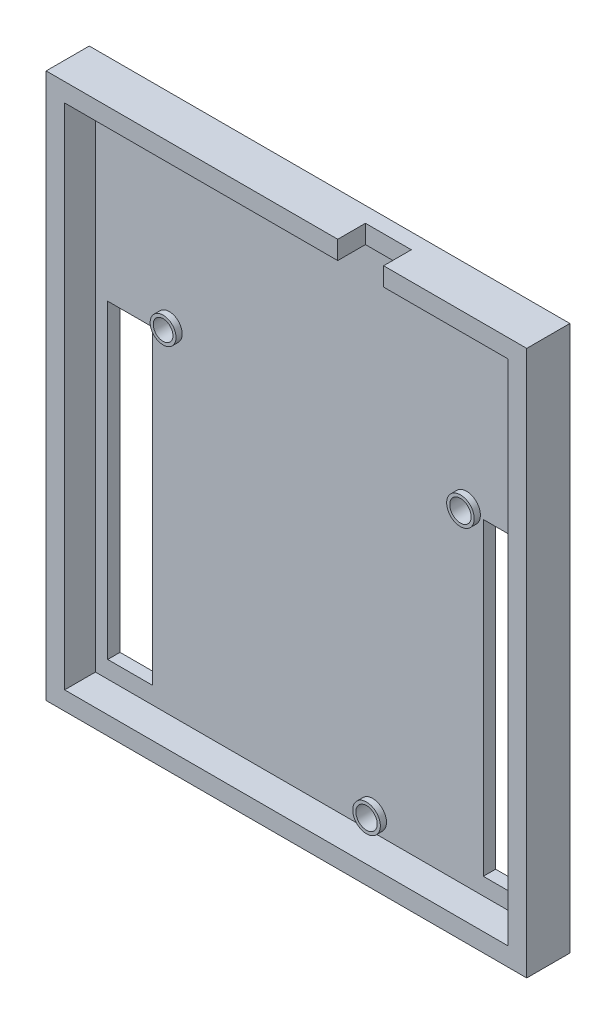
ISO-10303-21;
HEADER;
FILE_DESCRIPTION(('STEP AP214'),'2;1');
FILE_NAME('part.step','',(''),(''),'','','');
FILE_SCHEMA(('AUTOMOTIVE_DESIGN { 1 0 10303 214 1 1 1 1 }'));
ENDSEC;
DATA;
#1=APPLICATION_CONTEXT('core data for automotive mechanical design processes');
#2=APPLICATION_PROTOCOL_DEFINITION('international standard','automotive_design',2000,#1);
#3=PRODUCT_CONTEXT('',#1,'mechanical');
#4=PRODUCT('Part','Part','',(#3));
#5=PRODUCT_RELATED_PRODUCT_CATEGORY('part','',(#4));
#6=PRODUCT_DEFINITION_FORMATION('','',#4);
#7=PRODUCT_DEFINITION_CONTEXT('part definition',#1,'design');
#8=PRODUCT_DEFINITION('design','',#6,#7);
#9=PRODUCT_DEFINITION_SHAPE('','',#8);
#10=(LENGTH_UNIT() NAMED_UNIT(*) SI_UNIT(.MILLI.,.METRE.));
#11=(NAMED_UNIT(*) PLANE_ANGLE_UNIT() SI_UNIT($,.RADIAN.));
#12=(NAMED_UNIT(*) SI_UNIT($,.STERADIAN.) SOLID_ANGLE_UNIT());
#13=UNCERTAINTY_MEASURE_WITH_UNIT(LENGTH_MEASURE(1.E-05),#10,'distance_accuracy_value','');
#14=(GEOMETRIC_REPRESENTATION_CONTEXT(3) GLOBAL_UNCERTAINTY_ASSIGNED_CONTEXT((#13)) GLOBAL_UNIT_ASSIGNED_CONTEXT((#10,
#11,#12)) REPRESENTATION_CONTEXT('',''));
#15=CARTESIAN_POINT('',(0.,0.,0.));
#16=DIRECTION('',(0.,0.,1.));
#17=DIRECTION('',(1.,0.,0.));
#18=AXIS2_PLACEMENT_3D('',#15,#16,#17);
#19=CARTESIAN_POINT('',(0.,0.,0.));
#20=DIRECTION('',(0.,0.,-1.));
#21=DIRECTION('',(-1.,0.,0.));
#22=AXIS2_PLACEMENT_3D('',#19,#20,#21);
#23=PLANE('',#22);
#24=CARTESIAN_POINT('',(-4.23380391559715,-5.37064530337489,0.));
#25=DIRECTION('',(0.,0.,-1.));
#26=DIRECTION('',(-1.,0.,0.));
#27=AXIS2_PLACEMENT_3D('',#24,#25,#26);
#28=CIRCLE('',#27,2.1);
#29=CARTESIAN_POINT('',(-6.33380391559715,-5.37064530337489,0.));
#30=VERTEX_POINT('',#29);
#31=EDGE_CURVE('E66',#30,#30,#28,.F.);
#32=ORIENTED_EDGE('',*,*,#31,.F.);
#33=EDGE_LOOP('',(#32));
#34=FACE_BOUND('',#33,.T.);
#35=DIRECTION('',(0.,-1.,0.));
#36=VECTOR('',#35,1.);
#37=CARTESIAN_POINT('',(53.8161959828028,0.,0.));
#38=LINE('',#37,#36);
#39=CARTESIAN_POINT('',(53.8161959828028,-7.01064731112951,0.));
#40=VERTEX_POINT('',#39);
#41=CARTESIAN_POINT('',(53.8161959828028,-57.170647502784,0.));
#42=VERTEX_POINT('',#41);
#43=EDGE_CURVE('E234',#40,#42,#38,.T.);
#44=ORIENTED_EDGE('',*,*,#43,.T.);
#45=DIRECTION('',(1.,0.,0.));
#46=VECTOR('',#45,1.);
#47=CARTESIAN_POINT('',(0.,-57.170647502784,0.));
#48=LINE('',#47,#46);
#49=CARTESIAN_POINT('',(46.7361959866513,-57.170647502784,0.));
#50=VERTEX_POINT('',#49);
#51=EDGE_CURVE('E243',#50,#42,#48,.T.);
#52=ORIENTED_EDGE('',*,*,#51,.F.);
#53=DIRECTION('',(0.,-1.,0.));
#54=VECTOR('',#53,1.);
#55=CARTESIAN_POINT('',(46.7361959866513,0.,0.));
#56=LINE('',#55,#54);
#57=CARTESIAN_POINT('',(46.7361959866513,-7.01064731112951,0.));
#58=VERTEX_POINT('',#57);
#59=EDGE_CURVE('E240',#58,#50,#56,.T.);
#60=ORIENTED_EDGE('',*,*,#59,.F.);
#61=DIRECTION('',(1.,0.,0.));
#62=VECTOR('',#61,1.);
#63=CARTESIAN_POINT('',(0.,-7.01064731112951,0.));
#64=LINE('',#63,#62);
#65=EDGE_CURVE('E237',#58,#40,#64,.T.);
#66=ORIENTED_EDGE('',*,*,#65,.T.);
#67=EDGE_LOOP('',(#44,#52,#60,#66));
#68=FACE_BOUND('',#67,.T.);
#69=DIRECTION('',(0.,-1.,0.));
#70=VECTOR('',#69,1.);
#71=CARTESIAN_POINT('',(-16.2158273381295,22.5593525179856,0.));
#72=LINE('',#71,#70);
#73=CARTESIAN_POINT('',(-16.2158273381295,22.5593525179856,0.));
#74=VERTEX_POINT('',#73);
#75=CARTESIAN_POINT('',(-16.2158273381295,-59.9406474820144,0.));
#76=VERTEX_POINT('',#75);
#77=EDGE_CURVE('E317',#74,#76,#72,.T.);
#78=ORIENTED_EDGE('',*,*,#77,.T.);
#79=DIRECTION('',(1.,0.,0.));
#80=VECTOR('',#79,1.);
#81=CARTESIAN_POINT('',(-16.2158273381295,-59.9406474820144,0.));
#82=LINE('',#81,#80);
#83=CARTESIAN_POINT('',(55.7841726618705,-59.9406474820144,0.));
#84=VERTEX_POINT('',#83);
#85=EDGE_CURVE('E332',#76,#84,#82,.T.);
#86=ORIENTED_EDGE('',*,*,#85,.T.);
#87=DIRECTION('',(0.,1.,0.));
#88=VECTOR('',#87,1.);
#89=CARTESIAN_POINT('',(55.7841726618705,22.5593525179856,0.));
#90=LINE('',#89,#88);
#91=CARTESIAN_POINT('',(55.7841726618705,22.5593525179856,0.));
#92=VERTEX_POINT('',#91);
#93=EDGE_CURVE('E335',#84,#92,#90,.T.);
#94=ORIENTED_EDGE('',*,*,#93,.T.);
#95=DIRECTION('',(-1.,0.,0.));
#96=VECTOR('',#95,1.);
#97=CARTESIAN_POINT('',(-16.2158273381295,22.5593525179856,0.));
#98=LINE('',#97,#96);
#99=EDGE_CURVE('E321',#92,#74,#98,.T.);
#100=ORIENTED_EDGE('',*,*,#99,.T.);
#101=EDGE_LOOP('',(#78,#86,#94,#100));
#102=FACE_BOUND('',#101,.T.);
#103=DIRECTION('',(0.,-1.,0.));
#104=VECTOR('',#103,1.);
#105=CARTESIAN_POINT('',(-6.9438058706275,0.,0.));
#106=LINE('',#105,#104);
#107=CARTESIAN_POINT('',(-6.9438058706275,-6.8106451567476,0.));
#108=VERTEX_POINT('',#107);
#109=CARTESIAN_POINT('',(-6.9438058706275,-57.1706451567476,0.));
#110=VERTEX_POINT('',#109);
#111=EDGE_CURVE('E264',#108,#110,#106,.T.);
#112=ORIENTED_EDGE('',*,*,#111,.T.);
#113=DIRECTION('',(1.,0.,0.));
#114=VECTOR('',#113,1.);
#115=CARTESIAN_POINT('',(0.,-57.1706451567476,0.));
#116=LINE('',#115,#114);
#117=CARTESIAN_POINT('',(-14.2238040133487,-57.1706451567476,0.));
#118=VERTEX_POINT('',#117);
#119=EDGE_CURVE('E273',#118,#110,#116,.T.);
#120=ORIENTED_EDGE('',*,*,#119,.F.);
#121=DIRECTION('',(0.,-1.,0.));
#122=VECTOR('',#121,1.);
#123=CARTESIAN_POINT('',(-14.2238040133487,0.,0.));
#124=LINE('',#123,#122);
#125=CARTESIAN_POINT('',(-14.2238040133487,-6.8106451567476,0.));
#126=VERTEX_POINT('',#125);
#127=EDGE_CURVE('E270',#126,#118,#124,.T.);
#128=ORIENTED_EDGE('',*,*,#127,.F.);
#129=DIRECTION('',(1.,0.,0.));
#130=VECTOR('',#129,1.);
#131=CARTESIAN_POINT('',(0.,-6.8106451567476,0.));
#132=LINE('',#131,#130);
#133=EDGE_CURVE('E267',#126,#108,#132,.T.);
#134=ORIENTED_EDGE('',*,*,#133,.T.);
#135=EDGE_LOOP('',(#112,#120,#128,#134));
#136=FACE_BOUND('',#135,.T.);
#137=CARTESIAN_POINT('',(28.7861940804967,-57.4406465741446,0.));
#138=DIRECTION('',(0.,0.,-1.));
#139=DIRECTION('',(-1.,0.,0.));
#140=AXIS2_PLACEMENT_3D('',#137,#138,#139);
#141=CIRCLE('',#140,2.23800000000001);
#142=CARTESIAN_POINT('',(26.5481940804967,-57.4406465741446,0.));
#143=VERTEX_POINT('',#142);
#144=EDGE_CURVE('E367',#143,#143,#141,.F.);
#145=ORIENTED_EDGE('',*,*,#144,.F.);
#146=EDGE_LOOP('',(#145));
#147=FACE_BOUND('',#146,.T.);
#148=CARTESIAN_POINT('',(44.0261960355271,-6.64064716065375,0.));
#149=DIRECTION('',(0.,0.,-1.));
#150=DIRECTION('',(-1.,0.,0.));
#151=AXIS2_PLACEMENT_3D('',#148,#149,#150);
#152=CIRCLE('',#151,2.238);
#153=CARTESIAN_POINT('',(41.7881960355271,-6.64064716065375,0.));
#154=VERTEX_POINT('',#153);
#155=EDGE_CURVE('E12',#154,#154,#152,.F.);
#156=ORIENTED_EDGE('',*,*,#155,.F.);
#157=EDGE_LOOP('',(#156));
#158=FACE_BOUND('',#157,.T.);
#159=ADVANCED_FACE('F57',(#34,#68,#102,#136,#147,#158),#23,.F.);
#160=CARTESIAN_POINT('',(0.,0.,5.));
#161=DIRECTION('',(0.,0.,1.));
#162=DIRECTION('',(1.,0.,0.));
#163=AXIS2_PLACEMENT_3D('',#160,#161,#162);
#164=PLANE('',#163);
#165=DIRECTION('',(-1.,0.,0.));
#166=VECTOR('',#165,1.);
#167=CARTESIAN_POINT('',(-19.2158273381295,25.5593525179856,5.));
#168=LINE('',#167,#166);
#169=CARTESIAN_POINT('',(58.7841726618705,25.5593525179856,5.));
#170=VERTEX_POINT('',#169);
#171=CARTESIAN_POINT('',(35.5582965356646,25.5593525179856,5.));
#172=VERTEX_POINT('',#171);
#173=EDGE_CURVE('E356',#170,#172,#168,.T.);
#174=ORIENTED_EDGE('',*,*,#173,.T.);
#175=DIRECTION('',(0.,-1.,0.));
#176=VECTOR('',#175,1.);
#177=CARTESIAN_POINT('',(35.5582965356646,0.,5.));
#178=LINE('',#177,#176);
#179=CARTESIAN_POINT('',(35.5582965356646,22.5593525179856,5.));
#180=VERTEX_POINT('',#179);
#181=EDGE_CURVE('E230',#172,#180,#178,.T.);
#182=ORIENTED_EDGE('',*,*,#181,.T.);
#183=DIRECTION('',(-1.,0.,0.));
#184=VECTOR('',#183,1.);
#185=CARTESIAN_POINT('',(-16.2158273381295,22.5593525179856,5.));
#186=LINE('',#185,#184);
#187=CARTESIAN_POINT('',(55.7841726618705,22.5593525179856,5.));
#188=VERTEX_POINT('',#187);
#189=EDGE_CURVE('E327',#188,#180,#186,.T.);
#190=ORIENTED_EDGE('',*,*,#189,.F.);
#191=DIRECTION('',(0.,1.,0.));
#192=VECTOR('',#191,1.);
#193=CARTESIAN_POINT('',(55.7841726618705,22.5593525179856,5.));
#194=LINE('',#193,#192);
#195=CARTESIAN_POINT('',(55.7841726618705,-59.9406474820144,5.));
#196=VERTEX_POINT('',#195);
#197=EDGE_CURVE('E323',#196,#188,#194,.T.);
#198=ORIENTED_EDGE('',*,*,#197,.F.);
#199=DIRECTION('',(1.,0.,0.));
#200=VECTOR('',#199,1.);
#201=CARTESIAN_POINT('',(-16.2158273381295,-59.9406474820144,5.));
#202=LINE('',#201,#200);
#203=CARTESIAN_POINT('',(-16.2158273381295,-59.9406474820144,5.));
#204=VERTEX_POINT('',#203);
#205=EDGE_CURVE('E320',#204,#196,#202,.T.);
#206=ORIENTED_EDGE('',*,*,#205,.F.);
#207=DIRECTION('',(0.,-1.,0.));
#208=VECTOR('',#207,1.);
#209=CARTESIAN_POINT('',(-16.2158273381295,22.5593525179856,5.));
#210=LINE('',#209,#208);
#211=CARTESIAN_POINT('',(-16.2158273381295,22.5593525179856,5.));
#212=VERTEX_POINT('',#211);
#213=EDGE_CURVE('E318',#212,#204,#210,.T.);
#214=ORIENTED_EDGE('',*,*,#213,.F.);
#215=CARTESIAN_POINT('',(28.108296535665,22.5593525179856,5.));
#216=VERTEX_POINT('',#215);
#217=EDGE_CURVE('E326',#216,#212,#186,.T.);
#218=ORIENTED_EDGE('',*,*,#217,.F.);
#219=DIRECTION('',(0.,-1.,0.));
#220=VECTOR('',#219,1.);
#221=CARTESIAN_POINT('',(28.108296535665,0.,5.));
#222=LINE('',#221,#220);
#223=CARTESIAN_POINT('',(28.108296535665,25.5593525179856,5.));
#224=VERTEX_POINT('',#223);
#225=EDGE_CURVE('E74',#224,#216,#222,.T.);
#226=ORIENTED_EDGE('',*,*,#225,.F.);
#227=CARTESIAN_POINT('',(-19.2158273381295,25.5593525179856,5.));
#228=VERTEX_POINT('',#227);
#229=EDGE_CURVE('E355',#224,#228,#168,.T.);
#230=ORIENTED_EDGE('',*,*,#229,.T.);
#231=DIRECTION('',(0.,-1.,0.));
#232=VECTOR('',#231,1.);
#233=CARTESIAN_POINT('',(-19.2158273381295,25.5593525179856,5.));
#234=LINE('',#233,#232);
#235=CARTESIAN_POINT('',(-19.2158273381295,-62.9406474820144,5.));
#236=VERTEX_POINT('',#235);
#237=EDGE_CURVE('E348',#228,#236,#234,.T.);
#238=ORIENTED_EDGE('',*,*,#237,.T.);
#239=DIRECTION('',(1.,0.,0.));
#240=VECTOR('',#239,1.);
#241=CARTESIAN_POINT('',(-19.2158273381295,-62.9406474820144,5.));
#242=LINE('',#241,#240);
#243=CARTESIAN_POINT('',(58.7841726618705,-62.9406474820144,5.));
#244=VERTEX_POINT('',#243);
#245=EDGE_CURVE('E351',#236,#244,#242,.T.);
#246=ORIENTED_EDGE('',*,*,#245,.T.);
#247=DIRECTION('',(0.,1.,0.));
#248=VECTOR('',#247,1.);
#249=CARTESIAN_POINT('',(58.7841726618705,25.5593525179856,5.));
#250=LINE('',#249,#248);
#251=EDGE_CURVE('E353',#244,#170,#250,.T.);
#252=ORIENTED_EDGE('',*,*,#251,.T.);
#253=EDGE_LOOP('',(#174,#182,#190,#198,#206,#214,#218,#226,#230,#238,#246,#252));
#254=FACE_BOUND('',#253,.T.);
#255=ADVANCED_FACE('F399',(#254),#164,.T.);
#256=CARTESIAN_POINT('',(-19.2158273381295,25.5593525179856,5.));
#257=DIRECTION('',(0.,-1.,0.));
#258=DIRECTION('',(0.,0.,-1.));
#259=AXIS2_PLACEMENT_3D('',#256,#257,#258);
#260=PLANE('',#259);
#261=DIRECTION('',(0.,0.,-1.));
#262=VECTOR('',#261,1.);
#263=CARTESIAN_POINT('',(35.5582965356646,25.5593525179856,5.00000000000005));
#264=LINE('',#263,#262);
#265=CARTESIAN_POINT('',(35.5582965356646,25.5593525179856,0.502881954424252));
#266=VERTEX_POINT('',#265);
#267=EDGE_CURVE('E228',#172,#266,#264,.T.);
#268=ORIENTED_EDGE('',*,*,#267,.F.);
#269=ORIENTED_EDGE('',*,*,#173,.F.);
#270=DIRECTION('',(0.,0.,-1.));
#271=VECTOR('',#270,1.);
#272=CARTESIAN_POINT('',(58.7841726618705,25.5593525179856,5.));
#273=LINE('',#272,#271);
#274=CARTESIAN_POINT('',(58.7841726618705,25.5593525179856,-2.));
#275=VERTEX_POINT('',#274);
#276=EDGE_CURVE('E361',#170,#275,#273,.T.);
#277=ORIENTED_EDGE('',*,*,#276,.T.);
#278=DIRECTION('',(1.,0.,0.));
#279=VECTOR('',#278,1.);
#280=CARTESIAN_POINT('',(58.7841726618705,25.5593525179856,-2.));
#281=LINE('',#280,#279);
#282=CARTESIAN_POINT('',(-19.2158273381295,25.5593525179856,-2.));
#283=VERTEX_POINT('',#282);
#284=EDGE_CURVE('E314',#283,#275,#281,.T.);
#285=ORIENTED_EDGE('',*,*,#284,.F.);
#286=DIRECTION('',(0.,0.,-1.));
#287=VECTOR('',#286,1.);
#288=CARTESIAN_POINT('',(-19.2158273381295,25.5593525179856,5.));
#289=LINE('',#288,#287);
#290=EDGE_CURVE('E359',#228,#283,#289,.T.);
#291=ORIENTED_EDGE('',*,*,#290,.F.);
#292=ORIENTED_EDGE('',*,*,#229,.F.);
#293=DIRECTION('',(0.,0.,-1.));
#294=VECTOR('',#293,1.);
#295=CARTESIAN_POINT('',(28.108296535665,25.5593525179856,5.));
#296=LINE('',#295,#294);
#297=CARTESIAN_POINT('',(28.108296535665,25.5593525179856,0.502881954424252));
#298=VERTEX_POINT('',#297);
#299=EDGE_CURVE('E224',#224,#298,#296,.T.);
#300=ORIENTED_EDGE('',*,*,#299,.T.);
#301=DIRECTION('',(1.,0.,0.));
#302=VECTOR('',#301,1.);
#303=CARTESIAN_POINT('',(-19.2158273381295,25.5593525179856,0.502881954424252));
#304=LINE('',#303,#302);
#305=EDGE_CURVE('E204',#298,#266,#304,.T.);
#306=ORIENTED_EDGE('',*,*,#305,.T.);
#307=EDGE_LOOP('',(#268,#269,#277,#285,#291,#292,#300,#306));
#308=FACE_BOUND('',#307,.T.);
#309=ADVANCED_FACE('F480',(#308),#260,.F.);
#310=CARTESIAN_POINT('',(-16.2158273381295,22.5593525179856,5.));
#311=DIRECTION('',(0.,-1.,0.));
#312=DIRECTION('',(0.,0.,-1.));
#313=AXIS2_PLACEMENT_3D('',#310,#311,#312);
#314=PLANE('',#313);
#315=ORIENTED_EDGE('',*,*,#189,.T.);
#316=DIRECTION('',(0.,0.,-1.));
#317=VECTOR('',#316,1.);
#318=CARTESIAN_POINT('',(35.5582965356646,22.5593525179856,5.00000000000005));
#319=LINE('',#318,#317);
#320=CARTESIAN_POINT('',(35.5582965356646,22.5593525179856,0.502881954424252));
#321=VERTEX_POINT('',#320);
#322=EDGE_CURVE('E212',#180,#321,#319,.T.);
#323=ORIENTED_EDGE('',*,*,#322,.T.);
#324=DIRECTION('',(1.,0.,0.));
#325=VECTOR('',#324,1.);
#326=CARTESIAN_POINT('',(0.,22.5593525179856,0.502881954424252));
#327=LINE('',#326,#325);
#328=CARTESIAN_POINT('',(28.108296535665,22.5593525179856,0.502881954424252));
#329=VERTEX_POINT('',#328);
#330=EDGE_CURVE('E201',#329,#321,#327,.T.);
#331=ORIENTED_EDGE('',*,*,#330,.F.);
#332=DIRECTION('',(0.,0.,-1.));
#333=VECTOR('',#332,1.);
#334=CARTESIAN_POINT('',(28.108296535665,22.5593525179856,5.));
#335=LINE('',#334,#333);
#336=EDGE_CURVE('E208',#216,#329,#335,.T.);
#337=ORIENTED_EDGE('',*,*,#336,.F.);
#338=ORIENTED_EDGE('',*,*,#217,.T.);
#339=DIRECTION('',(0.,0.,-1.));
#340=VECTOR('',#339,1.);
#341=CARTESIAN_POINT('',(-16.2158273381295,22.5593525179856,5.));
#342=LINE('',#341,#340);
#343=EDGE_CURVE('E329',#212,#74,#342,.T.);
#344=ORIENTED_EDGE('',*,*,#343,.T.);
#345=ORIENTED_EDGE('',*,*,#99,.F.);
#346=DIRECTION('',(0.,0.,-1.));
#347=VECTOR('',#346,1.);
#348=CARTESIAN_POINT('',(55.7841726618705,22.5593525179856,5.));
#349=LINE('',#348,#347);
#350=EDGE_CURVE('E341',#188,#92,#349,.T.);
#351=ORIENTED_EDGE('',*,*,#350,.F.);
#352=EDGE_LOOP('',(#315,#323,#331,#337,#338,#344,#345,#351));
#353=FACE_BOUND('',#352,.T.);
#354=ADVANCED_FACE('F216',(#353),#314,.T.);
#355=CARTESIAN_POINT('',(0.,0.,-2.));
#356=DIRECTION('',(0.,0.,-1.));
#357=DIRECTION('',(-1.,0.,0.));
#358=AXIS2_PLACEMENT_3D('',#355,#356,#357);
#359=PLANE('',#358);
#360=DIRECTION('',(-1.,0.,0.));
#361=VECTOR('',#360,1.);
#362=CARTESIAN_POINT('',(0.,-57.1706451567476,-2.));
#363=LINE('',#362,#361);
#364=CARTESIAN_POINT('',(-6.9438058706275,-57.1706451567476,-2.));
#365=VERTEX_POINT('',#364);
#366=CARTESIAN_POINT('',(-14.2238040133487,-57.1706451567476,-2.));
#367=VERTEX_POINT('',#366);
#368=EDGE_CURVE('E291',#365,#367,#363,.T.);
#369=ORIENTED_EDGE('',*,*,#368,.F.);
#370=DIRECTION('',(0.,1.,0.));
#371=VECTOR('',#370,1.);
#372=CARTESIAN_POINT('',(-6.9438058706275,0.,-2.));
#373=LINE('',#372,#371);
#374=CARTESIAN_POINT('',(-6.9438058706275,-6.8106451567476,-2.));
#375=VERTEX_POINT('',#374);
#376=EDGE_CURVE('E293',#365,#375,#373,.T.);
#377=ORIENTED_EDGE('',*,*,#376,.T.);
#378=DIRECTION('',(-1.,0.,0.));
#379=VECTOR('',#378,1.);
#380=CARTESIAN_POINT('',(0.,-6.8106451567476,-2.));
#381=LINE('',#380,#379);
#382=CARTESIAN_POINT('',(-14.2238040133487,-6.8106451567476,-2.));
#383=VERTEX_POINT('',#382);
#384=EDGE_CURVE('E279',#375,#383,#381,.T.);
#385=ORIENTED_EDGE('',*,*,#384,.T.);
#386=DIRECTION('',(0.,1.,0.));
#387=VECTOR('',#386,1.);
#388=CARTESIAN_POINT('',(-14.2238040133487,0.,-2.));
#389=LINE('',#388,#387);
#390=EDGE_CURVE('E288',#367,#383,#389,.T.);
#391=ORIENTED_EDGE('',*,*,#390,.F.);
#392=EDGE_LOOP('',(#369,#377,#385,#391));
#393=FACE_BOUND('',#392,.T.);
#394=CARTESIAN_POINT('',(44.0261960355271,-6.64064716065375,-2.));
#395=DIRECTION('',(0.,0.,-1.));
#396=DIRECTION('',(-1.,0.,0.));
#397=AXIS2_PLACEMENT_3D('',#394,#395,#396);
#398=CIRCLE('',#397,1.738);
#399=CARTESIAN_POINT('',(42.2881960355271,-6.64064716065375,-2.));
#400=VERTEX_POINT('',#399);
#401=EDGE_CURVE('E299',#400,#400,#398,.T.);
#402=ORIENTED_EDGE('',*,*,#401,.F.);
#403=EDGE_LOOP('',(#402));
#404=FACE_BOUND('',#403,.T.);
#405=DIRECTION('',(0.,-1.,0.));
#406=VECTOR('',#405,1.);
#407=CARTESIAN_POINT('',(58.7841726618705,25.5593525179856,-2.));
#408=LINE('',#407,#406);
#409=CARTESIAN_POINT('',(58.7841726618705,-62.9406474820144,-2.));
#410=VERTEX_POINT('',#409);
#411=EDGE_CURVE('E305',#275,#410,#408,.T.);
#412=ORIENTED_EDGE('',*,*,#411,.T.);
#413=DIRECTION('',(-1.,0.,0.));
#414=VECTOR('',#413,1.);
#415=CARTESIAN_POINT('',(58.7841726618705,-62.9406474820144,-2.));
#416=LINE('',#415,#414);
#417=CARTESIAN_POINT('',(-19.2158273381295,-62.9406474820144,-2.));
#418=VERTEX_POINT('',#417);
#419=EDGE_CURVE('E308',#410,#418,#416,.T.);
#420=ORIENTED_EDGE('',*,*,#419,.T.);
#421=DIRECTION('',(0.,1.,0.));
#422=VECTOR('',#421,1.);
#423=CARTESIAN_POINT('',(-19.2158273381295,25.5593525179856,-2.));
#424=LINE('',#423,#422);
#425=EDGE_CURVE('E311',#418,#283,#424,.T.);
#426=ORIENTED_EDGE('',*,*,#425,.T.);
#427=ORIENTED_EDGE('',*,*,#284,.T.);
#428=EDGE_LOOP('',(#412,#420,#426,#427));
#429=FACE_BOUND('',#428,.T.);
#430=CARTESIAN_POINT('',(-4.23380391559715,-5.37064530337489,-2.));
#431=DIRECTION('',(0.,0.,-1.));
#432=DIRECTION('',(-1.,0.,0.));
#433=AXIS2_PLACEMENT_3D('',#430,#431,#432);
#434=CIRCLE('',#433,1.6);
#435=CARTESIAN_POINT('',(-5.83380391559715,-5.37064530337489,-2.));
#436=VERTEX_POINT('',#435);
#437=EDGE_CURVE('E302',#436,#436,#434,.T.);
#438=ORIENTED_EDGE('',*,*,#437,.F.);
#439=EDGE_LOOP('',(#438));
#440=FACE_BOUND('',#439,.T.);
#441=CARTESIAN_POINT('',(28.7861940804967,-57.4406465741446,-2.));
#442=DIRECTION('',(0.,0.,-1.));
#443=DIRECTION('',(-1.,0.,0.));
#444=AXIS2_PLACEMENT_3D('',#441,#442,#443);
#445=CIRCLE('',#444,1.738);
#446=CARTESIAN_POINT('',(27.0481940804967,-57.4406465741446,-2.));
#447=VERTEX_POINT('',#446);
#448=EDGE_CURVE('E296',#447,#447,#445,.T.);
#449=ORIENTED_EDGE('',*,*,#448,.F.);
#450=EDGE_LOOP('',(#449));
#451=FACE_BOUND('',#450,.T.);
#452=DIRECTION('',(-1.,0.,0.));
#453=VECTOR('',#452,1.);
#454=CARTESIAN_POINT('',(0.,-57.170647502784,-2.));
#455=LINE('',#454,#453);
#456=CARTESIAN_POINT('',(53.8161959828028,-57.170647502784,-2.));
#457=VERTEX_POINT('',#456);
#458=CARTESIAN_POINT('',(46.7361959866513,-57.170647502784,-2.));
#459=VERTEX_POINT('',#458);
#460=EDGE_CURVE('E259',#457,#459,#455,.T.);
#461=ORIENTED_EDGE('',*,*,#460,.F.);
#462=DIRECTION('',(0.,1.,0.));
#463=VECTOR('',#462,1.);
#464=CARTESIAN_POINT('',(53.8161959828028,0.,-2.));
#465=LINE('',#464,#463);
#466=CARTESIAN_POINT('',(53.8161959828028,-7.01064731112951,-2.));
#467=VERTEX_POINT('',#466);
#468=EDGE_CURVE('E261',#457,#467,#465,.T.);
#469=ORIENTED_EDGE('',*,*,#468,.T.);
#470=DIRECTION('',(-1.,0.,0.));
#471=VECTOR('',#470,1.);
#472=CARTESIAN_POINT('',(0.,-7.01064731112951,-2.));
#473=LINE('',#472,#471);
#474=CARTESIAN_POINT('',(46.7361959866513,-7.01064731112951,-2.));
#475=VERTEX_POINT('',#474);
#476=EDGE_CURVE('E249',#467,#475,#473,.T.);
#477=ORIENTED_EDGE('',*,*,#476,.T.);
#478=DIRECTION('',(0.,1.,0.));
#479=VECTOR('',#478,1.);
#480=CARTESIAN_POINT('',(46.7361959866513,0.,-2.));
#481=LINE('',#480,#479);
#482=EDGE_CURVE('E257',#459,#475,#481,.T.);
#483=ORIENTED_EDGE('',*,*,#482,.F.);
#484=EDGE_LOOP('',(#461,#469,#477,#483));
#485=FACE_BOUND('',#484,.T.);
#486=ADVANCED_FACE('F474',(#393,#404,#429,#440,#451,#485),#359,.T.);
#487=CARTESIAN_POINT('',(-19.2158273381295,25.5593525179856,5.));
#488=DIRECTION('',(1.,0.,0.));
#489=DIRECTION('',(0.,1.,0.));
#490=AXIS2_PLACEMENT_3D('',#487,#488,#489);
#491=PLANE('',#490);
#492=ORIENTED_EDGE('',*,*,#290,.T.);
#493=ORIENTED_EDGE('',*,*,#425,.F.);
#494=DIRECTION('',(0.,0.,-1.));
#495=VECTOR('',#494,1.);
#496=CARTESIAN_POINT('',(-19.2158273381295,-62.9406474820144,5.));
#497=LINE('',#496,#495);
#498=EDGE_CURVE('E213',#236,#418,#497,.T.);
#499=ORIENTED_EDGE('',*,*,#498,.F.);
#500=ORIENTED_EDGE('',*,*,#237,.F.);
#501=EDGE_LOOP('',(#492,#493,#499,#500));
#502=FACE_BOUND('',#501,.T.);
#503=ADVANCED_FACE('F59',(#502),#491,.F.);
#504=CARTESIAN_POINT('',(-19.2158273381295,-62.9406474820144,5.));
#505=DIRECTION('',(0.,1.,0.));
#506=DIRECTION('',(0.,0.,1.));
#507=AXIS2_PLACEMENT_3D('',#504,#505,#506);
#508=PLANE('',#507);
#509=ORIENTED_EDGE('',*,*,#498,.T.);
#510=ORIENTED_EDGE('',*,*,#419,.F.);
#511=DIRECTION('',(0.,0.,-1.));
#512=VECTOR('',#511,1.);
#513=CARTESIAN_POINT('',(58.7841726618705,-62.9406474820144,5.));
#514=LINE('',#513,#512);
#515=EDGE_CURVE('E363',#244,#410,#514,.T.);
#516=ORIENTED_EDGE('',*,*,#515,.F.);
#517=ORIENTED_EDGE('',*,*,#245,.F.);
#518=EDGE_LOOP('',(#509,#510,#516,#517));
#519=FACE_BOUND('',#518,.T.);
#520=ADVANCED_FACE('F500',(#519),#508,.F.);
#521=CARTESIAN_POINT('',(58.7841726618705,25.5593525179856,5.));
#522=DIRECTION('',(-1.,0.,0.));
#523=DIRECTION('',(0.,-1.,0.));
#524=AXIS2_PLACEMENT_3D('',#521,#522,#523);
#525=PLANE('',#524);
#526=ORIENTED_EDGE('',*,*,#515,.T.);
#527=ORIENTED_EDGE('',*,*,#411,.F.);
#528=ORIENTED_EDGE('',*,*,#276,.F.);
#529=ORIENTED_EDGE('',*,*,#251,.F.);
#530=EDGE_LOOP('',(#526,#527,#528,#529));
#531=FACE_BOUND('',#530,.T.);
#532=ADVANCED_FACE('F491',(#531),#525,.F.);
#533=CARTESIAN_POINT('',(-16.2158273381295,22.5593525179856,5.));
#534=DIRECTION('',(1.,0.,0.));
#535=DIRECTION('',(0.,1.,0.));
#536=AXIS2_PLACEMENT_3D('',#533,#534,#535);
#537=PLANE('',#536);
#538=ORIENTED_EDGE('',*,*,#77,.F.);
#539=ORIENTED_EDGE('',*,*,#343,.F.);
#540=ORIENTED_EDGE('',*,*,#213,.T.);
#541=DIRECTION('',(0.,0.,-1.));
#542=VECTOR('',#541,1.);
#543=CARTESIAN_POINT('',(-16.2158273381295,-59.9406474820144,5.));
#544=LINE('',#543,#542);
#545=EDGE_CURVE('E345',#204,#76,#544,.T.);
#546=ORIENTED_EDGE('',*,*,#545,.T.);
#547=EDGE_LOOP('',(#538,#539,#540,#546));
#548=FACE_BOUND('',#547,.T.);
#549=ADVANCED_FACE('F487',(#548),#537,.T.);
#550=CARTESIAN_POINT('',(-16.2158273381295,-59.9406474820144,5.));
#551=DIRECTION('',(0.,1.,0.));
#552=DIRECTION('',(0.,0.,1.));
#553=AXIS2_PLACEMENT_3D('',#550,#551,#552);
#554=PLANE('',#553);
#555=ORIENTED_EDGE('',*,*,#85,.F.);
#556=ORIENTED_EDGE('',*,*,#545,.F.);
#557=ORIENTED_EDGE('',*,*,#205,.T.);
#558=DIRECTION('',(0.,0.,-1.));
#559=VECTOR('',#558,1.);
#560=CARTESIAN_POINT('',(55.7841726618705,-59.9406474820144,5.));
#561=LINE('',#560,#559);
#562=EDGE_CURVE('E343',#196,#84,#561,.T.);
#563=ORIENTED_EDGE('',*,*,#562,.T.);
#564=EDGE_LOOP('',(#555,#556,#557,#563));
#565=FACE_BOUND('',#564,.T.);
#566=ADVANCED_FACE('F483',(#565),#554,.T.);
#567=CARTESIAN_POINT('',(55.7841726618705,22.5593525179856,5.));
#568=DIRECTION('',(-1.,0.,0.));
#569=DIRECTION('',(0.,-1.,0.));
#570=AXIS2_PLACEMENT_3D('',#567,#568,#569);
#571=PLANE('',#570);
#572=ORIENTED_EDGE('',*,*,#93,.F.);
#573=ORIENTED_EDGE('',*,*,#562,.F.);
#574=ORIENTED_EDGE('',*,*,#197,.T.);
#575=ORIENTED_EDGE('',*,*,#350,.T.);
#576=EDGE_LOOP('',(#572,#573,#574,#575));
#577=FACE_BOUND('',#576,.T.);
#578=ADVANCED_FACE('F472',(#577),#571,.T.);
#579=CARTESIAN_POINT('',(-4.23380391559715,-5.37064530337489,-2.));
#580=DIRECTION('',(0.,0.,1.));
#581=DIRECTION('',(1.,0.,0.));
#582=AXIS2_PLACEMENT_3D('',#579,#580,#581);
#583=CYLINDRICAL_SURFACE('',#582,1.6);
#584=ORIENTED_EDGE('',*,*,#437,.T.);
#585=EDGE_LOOP('',(#584));
#586=FACE_BOUND('',#585,.T.);
#587=CARTESIAN_POINT('',(-4.23380391559715,-5.37064530337489,1.));
#588=DIRECTION('',(0.,0.,1.));
#589=DIRECTION('',(1.,0.,0.));
#590=AXIS2_PLACEMENT_3D('',#587,#588,#589);
#591=CIRCLE('',#590,1.6);
#592=CARTESIAN_POINT('',(-2.63380391559716,-5.37064530337489,1.));
#593=VERTEX_POINT('',#592);
#594=EDGE_CURVE('E375',#593,#593,#591,.T.);
#595=ORIENTED_EDGE('',*,*,#594,.T.);
#596=EDGE_LOOP('',(#595));
#597=FACE_BOUND('',#596,.T.);
#598=ADVANCED_FACE('F468',(#586,#597),#583,.F.);
#599=CARTESIAN_POINT('',(44.0261960355271,-6.64064716065375,-2.));
#600=DIRECTION('',(0.,0.,1.));
#601=DIRECTION('',(1.,0.,0.));
#602=AXIS2_PLACEMENT_3D('',#599,#600,#601);
#603=CYLINDRICAL_SURFACE('',#602,1.738);
#604=ORIENTED_EDGE('',*,*,#401,.T.);
#605=EDGE_LOOP('',(#604));
#606=FACE_BOUND('',#605,.T.);
#607=CARTESIAN_POINT('',(44.0261960355271,-6.64064716065375,1.));
#608=DIRECTION('',(0.,0.,1.));
#609=DIRECTION('',(1.,0.,0.));
#610=AXIS2_PLACEMENT_3D('',#607,#608,#609);
#611=CIRCLE('',#610,1.738);
#612=CARTESIAN_POINT('',(45.7641960355271,-6.64064716065375,1.));
#613=VERTEX_POINT('',#612);
#614=EDGE_CURVE('E372',#613,#613,#611,.T.);
#615=ORIENTED_EDGE('',*,*,#614,.T.);
#616=EDGE_LOOP('',(#615));
#617=FACE_BOUND('',#616,.T.);
#618=ADVANCED_FACE('F464',(#606,#617),#603,.F.);
#619=CARTESIAN_POINT('',(28.7861940804967,-57.4406465741446,-2.));
#620=DIRECTION('',(0.,0.,1.));
#621=DIRECTION('',(1.,0.,0.));
#622=AXIS2_PLACEMENT_3D('',#619,#620,#621);
#623=CYLINDRICAL_SURFACE('',#622,1.738);
#624=ORIENTED_EDGE('',*,*,#448,.T.);
#625=EDGE_LOOP('',(#624));
#626=FACE_BOUND('',#625,.T.);
#627=CARTESIAN_POINT('',(28.7861940804967,-57.4406465741446,1.));
#628=DIRECTION('',(0.,0.,1.));
#629=DIRECTION('',(1.,0.,0.));
#630=AXIS2_PLACEMENT_3D('',#627,#628,#629);
#631=CIRCLE('',#630,1.738);
#632=CARTESIAN_POINT('',(30.5241940804967,-57.4406465741446,1.));
#633=VERTEX_POINT('',#632);
#634=EDGE_CURVE('E61',#633,#633,#631,.T.);
#635=ORIENTED_EDGE('',*,*,#634,.T.);
#636=EDGE_LOOP('',(#635));
#637=FACE_BOUND('',#636,.T.);
#638=ADVANCED_FACE('F382',(#626,#637),#623,.F.);
#639=CARTESIAN_POINT('',(-6.9438058706275,0.,-15.));
#640=DIRECTION('',(-1.,0.,0.));
#641=DIRECTION('',(0.,-1.,0.));
#642=AXIS2_PLACEMENT_3D('',#639,#640,#641);
#643=PLANE('',#642);
#644=DIRECTION('',(0.,0.,1.));
#645=VECTOR('',#644,1.);
#646=CARTESIAN_POINT('',(-6.9438058706275,-57.1706451567476,-15.));
#647=LINE('',#646,#645);
#648=EDGE_CURVE('E277',#365,#110,#647,.T.);
#649=ORIENTED_EDGE('',*,*,#648,.T.);
#650=ORIENTED_EDGE('',*,*,#111,.F.);
#651=DIRECTION('',(0.,0.,1.));
#652=VECTOR('',#651,1.);
#653=CARTESIAN_POINT('',(-6.9438058706275,-6.8106451567476,-15.));
#654=LINE('',#653,#652);
#655=EDGE_CURVE('E276',#375,#108,#654,.T.);
#656=ORIENTED_EDGE('',*,*,#655,.F.);
#657=ORIENTED_EDGE('',*,*,#376,.F.);
#658=EDGE_LOOP('',(#649,#650,#656,#657));
#659=FACE_BOUND('',#658,.T.);
#660=ADVANCED_FACE('F451',(#659),#643,.T.);
#661=CARTESIAN_POINT('',(0.,-57.1706451567476,-15.));
#662=DIRECTION('',(0.,-1.,0.));
#663=DIRECTION('',(0.,0.,-1.));
#664=AXIS2_PLACEMENT_3D('',#661,#662,#663);
#665=PLANE('',#664);
#666=ORIENTED_EDGE('',*,*,#368,.T.);
#667=DIRECTION('',(0.,0.,1.));
#668=VECTOR('',#667,1.);
#669=CARTESIAN_POINT('',(-14.2238040133487,-57.1706451567476,-15.));
#670=LINE('',#669,#668);
#671=EDGE_CURVE('E280',#367,#118,#670,.T.);
#672=ORIENTED_EDGE('',*,*,#671,.T.);
#673=ORIENTED_EDGE('',*,*,#119,.T.);
#674=ORIENTED_EDGE('',*,*,#648,.F.);
#675=EDGE_LOOP('',(#666,#672,#673,#674));
#676=FACE_BOUND('',#675,.T.);
#677=ADVANCED_FACE('F447',(#676),#665,.F.);
#678=CARTESIAN_POINT('',(-14.2238040133487,0.,-15.));
#679=DIRECTION('',(-1.,0.,0.));
#680=DIRECTION('',(0.,-1.,0.));
#681=AXIS2_PLACEMENT_3D('',#678,#679,#680);
#682=PLANE('',#681);
#683=ORIENTED_EDGE('',*,*,#390,.T.);
#684=DIRECTION('',(0.,0.,1.));
#685=VECTOR('',#684,1.);
#686=CARTESIAN_POINT('',(-14.2238040133487,-6.8106451567476,-15.));
#687=LINE('',#686,#685);
#688=EDGE_CURVE('E282',#383,#126,#687,.T.);
#689=ORIENTED_EDGE('',*,*,#688,.T.);
#690=ORIENTED_EDGE('',*,*,#127,.T.);
#691=ORIENTED_EDGE('',*,*,#671,.F.);
#692=EDGE_LOOP('',(#683,#689,#690,#691));
#693=FACE_BOUND('',#692,.T.);
#694=ADVANCED_FACE('F450',(#693),#682,.F.);
#695=CARTESIAN_POINT('',(0.,-6.8106451567476,-15.));
#696=DIRECTION('',(0.,-1.,0.));
#697=DIRECTION('',(0.,0.,-1.));
#698=AXIS2_PLACEMENT_3D('',#695,#696,#697);
#699=PLANE('',#698);
#700=ORIENTED_EDGE('',*,*,#655,.T.);
#701=ORIENTED_EDGE('',*,*,#133,.F.);
#702=ORIENTED_EDGE('',*,*,#688,.F.);
#703=ORIENTED_EDGE('',*,*,#384,.F.);
#704=EDGE_LOOP('',(#700,#701,#702,#703));
#705=FACE_BOUND('',#704,.T.);
#706=ADVANCED_FACE('F445',(#705),#699,.T.);
#707=CARTESIAN_POINT('',(53.8161959828028,0.,-15.));
#708=DIRECTION('',(-1.,0.,0.));
#709=DIRECTION('',(0.,-1.,0.));
#710=AXIS2_PLACEMENT_3D('',#707,#708,#709);
#711=PLANE('',#710);
#712=DIRECTION('',(0.,0.,1.));
#713=VECTOR('',#712,1.);
#714=CARTESIAN_POINT('',(53.8161959828028,-57.170647502784,-15.));
#715=LINE('',#714,#713);
#716=EDGE_CURVE('E247',#457,#42,#715,.T.);
#717=ORIENTED_EDGE('',*,*,#716,.T.);
#718=ORIENTED_EDGE('',*,*,#43,.F.);
#719=DIRECTION('',(0.,0.,1.));
#720=VECTOR('',#719,1.);
#721=CARTESIAN_POINT('',(53.8161959828028,-7.01064731112951,-15.));
#722=LINE('',#721,#720);
#723=EDGE_CURVE('E246',#467,#40,#722,.T.);
#724=ORIENTED_EDGE('',*,*,#723,.F.);
#725=ORIENTED_EDGE('',*,*,#468,.F.);
#726=EDGE_LOOP('',(#717,#718,#724,#725));
#727=FACE_BOUND('',#726,.T.);
#728=ADVANCED_FACE('F436',(#727),#711,.T.);
#729=CARTESIAN_POINT('',(0.,-57.170647502784,-15.));
#730=DIRECTION('',(0.,-1.,0.));
#731=DIRECTION('',(0.,0.,-1.));
#732=AXIS2_PLACEMENT_3D('',#729,#730,#731);
#733=PLANE('',#732);
#734=ORIENTED_EDGE('',*,*,#460,.T.);
#735=DIRECTION('',(0.,0.,1.));
#736=VECTOR('',#735,1.);
#737=CARTESIAN_POINT('',(46.7361959866513,-57.170647502784,-15.));
#738=LINE('',#737,#736);
#739=EDGE_CURVE('E250',#459,#50,#738,.T.);
#740=ORIENTED_EDGE('',*,*,#739,.T.);
#741=ORIENTED_EDGE('',*,*,#51,.T.);
#742=ORIENTED_EDGE('',*,*,#716,.F.);
#743=EDGE_LOOP('',(#734,#740,#741,#742));
#744=FACE_BOUND('',#743,.T.);
#745=ADVANCED_FACE('F432',(#744),#733,.F.);
#746=CARTESIAN_POINT('',(46.7361959866513,0.,-15.));
#747=DIRECTION('',(-1.,0.,0.));
#748=DIRECTION('',(0.,-1.,0.));
#749=AXIS2_PLACEMENT_3D('',#746,#747,#748);
#750=PLANE('',#749);
#751=ORIENTED_EDGE('',*,*,#482,.T.);
#752=DIRECTION('',(0.,0.,1.));
#753=VECTOR('',#752,1.);
#754=CARTESIAN_POINT('',(46.7361959866513,-7.01064731112951,-15.));
#755=LINE('',#754,#753);
#756=EDGE_CURVE('E82',#475,#58,#755,.T.);
#757=ORIENTED_EDGE('',*,*,#756,.T.);
#758=ORIENTED_EDGE('',*,*,#59,.T.);
#759=ORIENTED_EDGE('',*,*,#739,.F.);
#760=EDGE_LOOP('',(#751,#757,#758,#759));
#761=FACE_BOUND('',#760,.T.);
#762=ADVANCED_FACE('F435',(#761),#750,.F.);
#763=CARTESIAN_POINT('',(0.,-7.01064731112951,-15.));
#764=DIRECTION('',(0.,-1.,0.));
#765=DIRECTION('',(0.,0.,-1.));
#766=AXIS2_PLACEMENT_3D('',#763,#764,#765);
#767=PLANE('',#766);
#768=ORIENTED_EDGE('',*,*,#723,.T.);
#769=ORIENTED_EDGE('',*,*,#65,.F.);
#770=ORIENTED_EDGE('',*,*,#756,.F.);
#771=ORIENTED_EDGE('',*,*,#476,.F.);
#772=EDGE_LOOP('',(#768,#769,#770,#771));
#773=FACE_BOUND('',#772,.T.);
#774=ADVANCED_FACE('F429',(#773),#767,.T.);
#775=CARTESIAN_POINT('',(0.,38.5593525179856,0.502881954424252));
#776=DIRECTION('',(0.,0.,-1.));
#777=DIRECTION('',(-1.,0.,0.));
#778=AXIS2_PLACEMENT_3D('',#775,#776,#777);
#779=PLANE('',#778);
#780=DIRECTION('',(0.,-1.,0.));
#781=VECTOR('',#780,1.);
#782=CARTESIAN_POINT('',(28.108296535665,38.5593525179856,0.502881954424252));
#783=LINE('',#782,#781);
#784=EDGE_CURVE('E197',#298,#329,#783,.T.);
#785=ORIENTED_EDGE('',*,*,#784,.T.);
#786=ORIENTED_EDGE('',*,*,#330,.T.);
#787=DIRECTION('',(0.,-1.,0.));
#788=VECTOR('',#787,1.);
#789=CARTESIAN_POINT('',(35.5582965356646,38.5593525179856,0.502881954424252));
#790=LINE('',#789,#788);
#791=EDGE_CURVE('E206',#266,#321,#790,.T.);
#792=ORIENTED_EDGE('',*,*,#791,.F.);
#793=ORIENTED_EDGE('',*,*,#305,.F.);
#794=EDGE_LOOP('',(#785,#786,#792,#793));
#795=FACE_BOUND('',#794,.T.);
#796=ADVANCED_FACE('F198',(#795),#779,.F.);
#797=CARTESIAN_POINT('',(35.5582965356646,38.5593525179856,0.));
#798=DIRECTION('',(-1.,0.,0.));
#799=DIRECTION('',(0.,0.,1.));
#800=AXIS2_PLACEMENT_3D('',#797,#798,#799);
#801=PLANE('',#800);
#802=ORIENTED_EDGE('',*,*,#267,.T.);
#803=ORIENTED_EDGE('',*,*,#791,.T.);
#804=ORIENTED_EDGE('',*,*,#322,.F.);
#805=ORIENTED_EDGE('',*,*,#181,.F.);
#806=EDGE_LOOP('',(#802,#803,#804,#805));
#807=FACE_BOUND('',#806,.T.);
#808=ADVANCED_FACE('F423',(#807),#801,.T.);
#809=CARTESIAN_POINT('',(28.108296535665,38.5593525179856,0.));
#810=DIRECTION('',(-1.,0.,0.));
#811=DIRECTION('',(0.,0.,1.));
#812=AXIS2_PLACEMENT_3D('',#809,#810,#811);
#813=PLANE('',#812);
#814=ORIENTED_EDGE('',*,*,#225,.T.);
#815=ORIENTED_EDGE('',*,*,#336,.T.);
#816=ORIENTED_EDGE('',*,*,#784,.F.);
#817=ORIENTED_EDGE('',*,*,#299,.F.);
#818=EDGE_LOOP('',(#814,#815,#816,#817));
#819=FACE_BOUND('',#818,.T.);
#820=ADVANCED_FACE('F209',(#819),#813,.F.);
#821=CARTESIAN_POINT('',(28.7861940804967,-57.4406465741446,1.));
#822=DIRECTION('',(0.,0.,-1.));
#823=DIRECTION('',(-1.,0.,0.));
#824=AXIS2_PLACEMENT_3D('',#821,#822,#823);
#825=CYLINDRICAL_SURFACE('',#824,2.23800000000001);
#826=CARTESIAN_POINT('',(28.7861940804967,-57.4406465741446,1.));
#827=DIRECTION('',(0.,0.,1.));
#828=DIRECTION('',(1.,0.,0.));
#829=AXIS2_PLACEMENT_3D('',#826,#827,#828);
#830=CIRCLE('',#829,2.23800000000001);
#831=CARTESIAN_POINT('',(31.0241940804967,-57.4406465741446,1.));
#832=VERTEX_POINT('',#831);
#833=EDGE_CURVE('E217',#832,#832,#830,.T.);
#834=ORIENTED_EDGE('',*,*,#833,.F.);
#835=EDGE_LOOP('',(#834));
#836=FACE_BOUND('',#835,.T.);
#837=ORIENTED_EDGE('',*,*,#144,.T.);
#838=EDGE_LOOP('',(#837));
#839=FACE_BOUND('',#838,.T.);
#840=ADVANCED_FACE('F388',(#836,#839),#825,.T.);
#841=CARTESIAN_POINT('',(28.7861940804967,-57.4406465741446,1.));
#842=DIRECTION('',(0.,0.,1.));
#843=DIRECTION('',(1.,0.,0.));
#844=AXIS2_PLACEMENT_3D('',#841,#842,#843);
#845=PLANE('',#844);
#846=ORIENTED_EDGE('',*,*,#634,.F.);
#847=EDGE_LOOP('',(#846));
#848=FACE_BOUND('',#847,.T.);
#849=ORIENTED_EDGE('',*,*,#833,.T.);
#850=EDGE_LOOP('',(#849));
#851=FACE_BOUND('',#850,.T.);
#852=ADVANCED_FACE('F384',(#848,#851),#845,.T.);
#853=CARTESIAN_POINT('',(-4.23380391559715,-5.37064530337489,1.));
#854=DIRECTION('',(0.,0.,-1.));
#855=DIRECTION('',(-1.,0.,0.));
#856=AXIS2_PLACEMENT_3D('',#853,#854,#855);
#857=CYLINDRICAL_SURFACE('',#856,2.1);
#858=CARTESIAN_POINT('',(-4.23380391559715,-5.37064530337489,1.));
#859=DIRECTION('',(0.,0.,1.));
#860=DIRECTION('',(1.,0.,0.));
#861=AXIS2_PLACEMENT_3D('',#858,#859,#860);
#862=CIRCLE('',#861,2.1);
#863=CARTESIAN_POINT('',(-2.13380391559716,-5.37064530337489,1.));
#864=VERTEX_POINT('',#863);
#865=EDGE_CURVE('E220',#864,#864,#862,.T.);
#866=ORIENTED_EDGE('',*,*,#865,.F.);
#867=EDGE_LOOP('',(#866));
#868=FACE_BOUND('',#867,.T.);
#869=ORIENTED_EDGE('',*,*,#31,.T.);
#870=EDGE_LOOP('',(#869));
#871=FACE_BOUND('',#870,.T.);
#872=ADVANCED_FACE('F387',(#868,#871),#857,.T.);
#873=CARTESIAN_POINT('',(-4.23380391559715,-5.37064530337489,1.));
#874=DIRECTION('',(0.,0.,1.));
#875=DIRECTION('',(1.,0.,0.));
#876=AXIS2_PLACEMENT_3D('',#873,#874,#875);
#877=PLANE('',#876);
#878=ORIENTED_EDGE('',*,*,#594,.F.);
#879=EDGE_LOOP('',(#878));
#880=FACE_BOUND('',#879,.T.);
#881=ORIENTED_EDGE('',*,*,#865,.T.);
#882=EDGE_LOOP('',(#881));
#883=FACE_BOUND('',#882,.T.);
#884=ADVANCED_FACE('F407',(#880,#883),#877,.T.);
#885=CARTESIAN_POINT('',(44.0261960355271,-6.64064716065375,1.));
#886=DIRECTION('',(0.,0.,-1.));
#887=DIRECTION('',(-1.,0.,0.));
#888=AXIS2_PLACEMENT_3D('',#885,#886,#887);
#889=CYLINDRICAL_SURFACE('',#888,2.238);
#890=CARTESIAN_POINT('',(44.0261960355271,-6.64064716065375,1.));
#891=DIRECTION('',(0.,0.,1.));
#892=DIRECTION('',(1.,0.,0.));
#893=AXIS2_PLACEMENT_3D('',#890,#891,#892);
#894=CIRCLE('',#893,2.238);
#895=CARTESIAN_POINT('',(46.2641960355271,-6.64064716065375,1.));
#896=VERTEX_POINT('',#895);
#897=EDGE_CURVE('E374',#896,#896,#894,.T.);
#898=ORIENTED_EDGE('',*,*,#897,.F.);
#899=EDGE_LOOP('',(#898));
#900=FACE_BOUND('',#899,.T.);
#901=ORIENTED_EDGE('',*,*,#155,.T.);
#902=EDGE_LOOP('',(#901));
#903=FACE_BOUND('',#902,.T.);
#904=ADVANCED_FACE('F404',(#900,#903),#889,.T.);
#905=CARTESIAN_POINT('',(44.0261960355271,-6.64064716065375,1.));
#906=DIRECTION('',(0.,0.,1.));
#907=DIRECTION('',(1.,0.,0.));
#908=AXIS2_PLACEMENT_3D('',#905,#906,#907);
#909=PLANE('',#908);
#910=ORIENTED_EDGE('',*,*,#614,.F.);
#911=EDGE_LOOP('',(#910));
#912=FACE_BOUND('',#911,.T.);
#913=ORIENTED_EDGE('',*,*,#897,.T.);
#914=EDGE_LOOP('',(#913));
#915=FACE_BOUND('',#914,.T.);
#916=ADVANCED_FACE('F406',(#912,#915),#909,.T.);
#917=CLOSED_SHELL('',(#159,#255,#309,#354,#486,#503,#520,#532,#549,#566,#578,#598,#618,#638,
#660,#677,#694,#706,#728,#745,#762,#774,#796,#808,#820,#840,#852,#872,#884,#904,#916));
#918=MANIFOLD_SOLID_BREP('B2',#917);
#919=ADVANCED_BREP_SHAPE_REPRESENTATION('',(#18,#918),#14);
#920=SHAPE_DEFINITION_REPRESENTATION(#9,#919);
ENDSEC;
END-ISO-10303-21;
